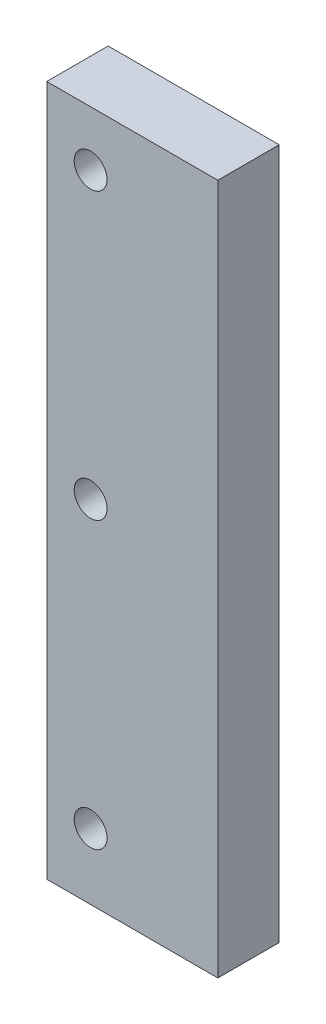
ISO-10303-21;
HEADER;
FILE_DESCRIPTION(('STEP AP214'),'2;1');
FILE_NAME('part.step','',(''),(''),'','','');
FILE_SCHEMA(('AUTOMOTIVE_DESIGN { 1 0 10303 214 1 1 1 1 }'));
ENDSEC;
DATA;
#1=APPLICATION_CONTEXT('core data for automotive mechanical design processes');
#2=APPLICATION_PROTOCOL_DEFINITION('international standard','automotive_design',2000,#1);
#3=PRODUCT_CONTEXT('',#1,'mechanical');
#4=PRODUCT('Part','Part','',(#3));
#5=PRODUCT_RELATED_PRODUCT_CATEGORY('part','',(#4));
#6=PRODUCT_DEFINITION_FORMATION('','',#4);
#7=PRODUCT_DEFINITION_CONTEXT('part definition',#1,'design');
#8=PRODUCT_DEFINITION('design','',#6,#7);
#9=PRODUCT_DEFINITION_SHAPE('','',#8);
#10=(LENGTH_UNIT() NAMED_UNIT(*) SI_UNIT(.MILLI.,.METRE.));
#11=(NAMED_UNIT(*) PLANE_ANGLE_UNIT() SI_UNIT($,.RADIAN.));
#12=(NAMED_UNIT(*) SI_UNIT($,.STERADIAN.) SOLID_ANGLE_UNIT());
#13=UNCERTAINTY_MEASURE_WITH_UNIT(LENGTH_MEASURE(1.E-05),#10,'distance_accuracy_value','');
#14=(GEOMETRIC_REPRESENTATION_CONTEXT(3) GLOBAL_UNCERTAINTY_ASSIGNED_CONTEXT((#13)) GLOBAL_UNIT_ASSIGNED_CONTEXT((#10,
#11,#12)) REPRESENTATION_CONTEXT('',''));
#15=CARTESIAN_POINT('',(0.,0.,0.));
#16=DIRECTION('',(0.,0.,1.));
#17=DIRECTION('',(1.,0.,0.));
#18=AXIS2_PLACEMENT_3D('',#15,#16,#17);
#19=CARTESIAN_POINT('',(-46.5606060606061,253.648268398268,28.));
#20=DIRECTION('',(1.,0.,0.));
#21=DIRECTION('',(0.,1.,0.));
#22=AXIS2_PLACEMENT_3D('',#19,#20,#21);
#23=PLANE('',#22);
#24=DIRECTION('',(0.,-1.,0.));
#25=VECTOR('',#24,1.);
#26=CARTESIAN_POINT('',(-46.5606060606061,253.648268398268,0.));
#27=LINE('',#26,#25);
#28=CARTESIAN_POINT('',(-46.5606060606061,253.648268398268,0.));
#29=VERTEX_POINT('',#28);
#30=CARTESIAN_POINT('',(-46.5606060606061,-61.3517316017316,0.));
#31=VERTEX_POINT('',#30);
#32=EDGE_CURVE('E103',#29,#31,#27,.T.);
#33=ORIENTED_EDGE('',*,*,#32,.T.);
#34=DIRECTION('',(0.,0.,-1.));
#35=VECTOR('',#34,1.);
#36=CARTESIAN_POINT('',(-46.5606060606061,-61.3517316017316,28.));
#37=LINE('',#36,#35);
#38=CARTESIAN_POINT('',(-46.5606060606061,-61.3517316017316,28.));
#39=VERTEX_POINT('',#38);
#40=EDGE_CURVE('E11',#39,#31,#37,.T.);
#41=ORIENTED_EDGE('',*,*,#40,.F.);
#42=DIRECTION('',(0.,-1.,0.));
#43=VECTOR('',#42,1.);
#44=CARTESIAN_POINT('',(-46.5606060606061,253.648268398268,28.));
#45=LINE('',#44,#43);
#46=CARTESIAN_POINT('',(-46.5606060606061,253.648268398268,28.));
#47=VERTEX_POINT('',#46);
#48=EDGE_CURVE('E91',#47,#39,#45,.T.);
#49=ORIENTED_EDGE('',*,*,#48,.F.);
#50=DIRECTION('',(0.,0.,-1.));
#51=VECTOR('',#50,1.);
#52=CARTESIAN_POINT('',(-46.5606060606061,253.648268398268,28.));
#53=LINE('',#52,#51);
#54=EDGE_CURVE('E99',#47,#29,#53,.T.);
#55=ORIENTED_EDGE('',*,*,#54,.T.);
#56=EDGE_LOOP('',(#33,#41,#49,#55));
#57=FACE_BOUND('',#56,.T.);
#58=ADVANCED_FACE('F40',(#57),#23,.F.);
#59=CARTESIAN_POINT('',(-46.5606060606061,-61.3517316017316,28.));
#60=DIRECTION('',(0.,1.,0.));
#61=DIRECTION('',(0.,0.,1.));
#62=AXIS2_PLACEMENT_3D('',#59,#60,#61);
#63=PLANE('',#62);
#64=DIRECTION('',(1.,0.,0.));
#65=VECTOR('',#64,1.);
#66=CARTESIAN_POINT('',(-46.5606060606061,-61.3517316017316,0.));
#67=LINE('',#66,#65);
#68=CARTESIAN_POINT('',(31.4393939393939,-61.3517316017316,0.));
#69=VERTEX_POINT('',#68);
#70=EDGE_CURVE('E95',#31,#69,#67,.T.);
#71=ORIENTED_EDGE('',*,*,#70,.T.);
#72=DIRECTION('',(0.,0.,-1.));
#73=VECTOR('',#72,1.);
#74=CARTESIAN_POINT('',(31.4393939393939,-61.3517316017316,28.));
#75=LINE('',#74,#73);
#76=CARTESIAN_POINT('',(31.4393939393939,-61.3517316017316,28.));
#77=VERTEX_POINT('',#76);
#78=EDGE_CURVE('E48',#77,#69,#75,.T.);
#79=ORIENTED_EDGE('',*,*,#78,.F.);
#80=DIRECTION('',(1.,0.,0.));
#81=VECTOR('',#80,1.);
#82=CARTESIAN_POINT('',(-46.5606060606061,-61.3517316017316,28.));
#83=LINE('',#82,#81);
#84=EDGE_CURVE('E86',#39,#77,#83,.T.);
#85=ORIENTED_EDGE('',*,*,#84,.F.);
#86=ORIENTED_EDGE('',*,*,#40,.T.);
#87=EDGE_LOOP('',(#71,#79,#85,#86));
#88=FACE_BOUND('',#87,.T.);
#89=ADVANCED_FACE('F94',(#88),#63,.F.);
#90=CARTESIAN_POINT('',(31.4393939393939,253.648268398268,28.));
#91=DIRECTION('',(-1.,0.,0.));
#92=DIRECTION('',(0.,-1.,0.));
#93=AXIS2_PLACEMENT_3D('',#90,#91,#92);
#94=PLANE('',#93);
#95=DIRECTION('',(0.,1.,0.));
#96=VECTOR('',#95,1.);
#97=CARTESIAN_POINT('',(31.4393939393939,253.648268398268,0.));
#98=LINE('',#97,#96);
#99=CARTESIAN_POINT('',(31.4393939393939,253.648268398268,0.));
#100=VERTEX_POINT('',#99);
#101=EDGE_CURVE('E73',#69,#100,#98,.T.);
#102=ORIENTED_EDGE('',*,*,#101,.T.);
#103=DIRECTION('',(0.,0.,-1.));
#104=VECTOR('',#103,1.);
#105=CARTESIAN_POINT('',(31.4393939393939,253.648268398268,28.));
#106=LINE('',#105,#104);
#107=CARTESIAN_POINT('',(31.4393939393939,253.648268398268,28.));
#108=VERTEX_POINT('',#107);
#109=EDGE_CURVE('E96',#108,#100,#106,.T.);
#110=ORIENTED_EDGE('',*,*,#109,.F.);
#111=DIRECTION('',(0.,1.,0.));
#112=VECTOR('',#111,1.);
#113=CARTESIAN_POINT('',(31.4393939393939,253.648268398268,28.));
#114=LINE('',#113,#112);
#115=EDGE_CURVE('E89',#77,#108,#114,.T.);
#116=ORIENTED_EDGE('',*,*,#115,.F.);
#117=ORIENTED_EDGE('',*,*,#78,.T.);
#118=EDGE_LOOP('',(#102,#110,#116,#117));
#119=FACE_BOUND('',#118,.T.);
#120=ADVANCED_FACE('F97',(#119),#94,.F.);
#121=CARTESIAN_POINT('',(-46.5606060606061,253.648268398268,28.));
#122=DIRECTION('',(0.,-1.,0.));
#123=DIRECTION('',(0.,0.,-1.));
#124=AXIS2_PLACEMENT_3D('',#121,#122,#123);
#125=PLANE('',#124);
#126=DIRECTION('',(-1.,0.,0.));
#127=VECTOR('',#126,1.);
#128=CARTESIAN_POINT('',(-46.5606060606061,253.648268398268,0.));
#129=LINE('',#128,#127);
#130=EDGE_CURVE('E79',#100,#29,#129,.T.);
#131=ORIENTED_EDGE('',*,*,#130,.T.);
#132=ORIENTED_EDGE('',*,*,#54,.F.);
#133=DIRECTION('',(-1.,0.,0.));
#134=VECTOR('',#133,1.);
#135=CARTESIAN_POINT('',(-46.5606060606061,253.648268398268,28.));
#136=LINE('',#135,#134);
#137=EDGE_CURVE('E56',#108,#47,#136,.T.);
#138=ORIENTED_EDGE('',*,*,#137,.F.);
#139=ORIENTED_EDGE('',*,*,#109,.T.);
#140=EDGE_LOOP('',(#131,#132,#138,#139));
#141=FACE_BOUND('',#140,.T.);
#142=ADVANCED_FACE('F111',(#141),#125,.F.);
#143=CARTESIAN_POINT('',(0.,0.,28.));
#144=DIRECTION('',(0.,0.,1.));
#145=DIRECTION('',(1.,0.,0.));
#146=AXIS2_PLACEMENT_3D('',#143,#144,#145);
#147=PLANE('',#146);
#148=CARTESIAN_POINT('',(-26.5606060606061,228.648268398268,28.));
#149=DIRECTION('',(0.,0.,1.));
#150=DIRECTION('',(1.,0.,0.));
#151=AXIS2_PLACEMENT_3D('',#148,#149,#150);
#152=CIRCLE('',#151,7.5);
#153=CARTESIAN_POINT('',(-19.0606060606061,228.648268398268,28.));
#154=VERTEX_POINT('',#153);
#155=EDGE_CURVE('E127',#154,#154,#152,.T.);
#156=ORIENTED_EDGE('',*,*,#155,.F.);
#157=EDGE_LOOP('',(#156));
#158=FACE_BOUND('',#157,.T.);
#159=CARTESIAN_POINT('',(-26.5606060606061,98.6482683982684,28.));
#160=DIRECTION('',(0.,0.,1.));
#161=DIRECTION('',(1.,0.,0.));
#162=AXIS2_PLACEMENT_3D('',#159,#160,#161);
#163=CIRCLE('',#162,7.5);
#164=CARTESIAN_POINT('',(-19.0606060606061,98.6482683982684,28.));
#165=VERTEX_POINT('',#164);
#166=EDGE_CURVE('E124',#165,#165,#163,.T.);
#167=ORIENTED_EDGE('',*,*,#166,.F.);
#168=EDGE_LOOP('',(#167));
#169=FACE_BOUND('',#168,.T.);
#170=CARTESIAN_POINT('',(-26.5606060606061,-31.3517316017316,28.));
#171=DIRECTION('',(0.,0.,1.));
#172=DIRECTION('',(1.,0.,0.));
#173=AXIS2_PLACEMENT_3D('',#170,#171,#172);
#174=CIRCLE('',#173,7.5);
#175=CARTESIAN_POINT('',(-19.0606060606061,-31.3517316017316,28.));
#176=VERTEX_POINT('',#175);
#177=EDGE_CURVE('E117',#176,#176,#174,.T.);
#178=ORIENTED_EDGE('',*,*,#177,.F.);
#179=EDGE_LOOP('',(#178));
#180=FACE_BOUND('',#179,.T.);
#181=ORIENTED_EDGE('',*,*,#48,.T.);
#182=ORIENTED_EDGE('',*,*,#84,.T.);
#183=ORIENTED_EDGE('',*,*,#115,.T.);
#184=ORIENTED_EDGE('',*,*,#137,.T.);
#185=EDGE_LOOP('',(#181,#182,#183,#184));
#186=FACE_BOUND('',#185,.T.);
#187=ADVANCED_FACE('F87',(#158,#169,#180,#186),#147,.T.);
#188=CARTESIAN_POINT('',(0.,0.,0.));
#189=DIRECTION('',(0.,0.,1.));
#190=DIRECTION('',(1.,0.,0.));
#191=AXIS2_PLACEMENT_3D('',#188,#189,#190);
#192=PLANE('',#191);
#193=CARTESIAN_POINT('',(-26.5606060606061,228.648268398268,0.));
#194=DIRECTION('',(0.,0.,1.));
#195=DIRECTION('',(1.,0.,0.));
#196=AXIS2_PLACEMENT_3D('',#193,#194,#195);
#197=CIRCLE('',#196,7.5);
#198=CARTESIAN_POINT('',(-19.0606060606061,228.648268398268,0.));
#199=VERTEX_POINT('',#198);
#200=EDGE_CURVE('E106',#199,#199,#197,.F.);
#201=ORIENTED_EDGE('',*,*,#200,.F.);
#202=EDGE_LOOP('',(#201));
#203=FACE_BOUND('',#202,.T.);
#204=CARTESIAN_POINT('',(-26.5606060606061,98.6482683982684,0.));
#205=DIRECTION('',(0.,0.,1.));
#206=DIRECTION('',(1.,0.,0.));
#207=AXIS2_PLACEMENT_3D('',#204,#205,#206);
#208=CIRCLE('',#207,7.5);
#209=CARTESIAN_POINT('',(-19.0606060606061,98.6482683982684,0.));
#210=VERTEX_POINT('',#209);
#211=EDGE_CURVE('E120',#210,#210,#208,.F.);
#212=ORIENTED_EDGE('',*,*,#211,.F.);
#213=EDGE_LOOP('',(#212));
#214=FACE_BOUND('',#213,.T.);
#215=CARTESIAN_POINT('',(-26.5606060606061,-31.3517316017316,0.));
#216=DIRECTION('',(0.,0.,1.));
#217=DIRECTION('',(1.,0.,0.));
#218=AXIS2_PLACEMENT_3D('',#215,#216,#217);
#219=CIRCLE('',#218,7.5);
#220=CARTESIAN_POINT('',(-19.0606060606061,-31.3517316017316,0.));
#221=VERTEX_POINT('',#220);
#222=EDGE_CURVE('E121',#221,#221,#219,.F.);
#223=ORIENTED_EDGE('',*,*,#222,.F.);
#224=EDGE_LOOP('',(#223));
#225=FACE_BOUND('',#224,.T.);
#226=ORIENTED_EDGE('',*,*,#32,.F.);
#227=ORIENTED_EDGE('',*,*,#130,.F.);
#228=ORIENTED_EDGE('',*,*,#101,.F.);
#229=ORIENTED_EDGE('',*,*,#70,.F.);
#230=EDGE_LOOP('',(#226,#227,#228,#229));
#231=FACE_BOUND('',#230,.T.);
#232=ADVANCED_FACE('F114',(#203,#214,#225,#231),#192,.F.);
#233=CARTESIAN_POINT('',(-26.5606060606061,-31.3517316017316,-21.2132034355964));
#234=DIRECTION('',(0.,0.,1.));
#235=DIRECTION('',(1.,0.,0.));
#236=AXIS2_PLACEMENT_3D('',#233,#234,#235);
#237=CYLINDRICAL_SURFACE('',#236,7.5);
#238=ORIENTED_EDGE('',*,*,#222,.T.);
#239=EDGE_LOOP('',(#238));
#240=FACE_BOUND('',#239,.T.);
#241=ORIENTED_EDGE('',*,*,#177,.T.);
#242=EDGE_LOOP('',(#241));
#243=FACE_BOUND('',#242,.T.);
#244=ADVANCED_FACE('F144',(#240,#243),#237,.F.);
#245=CARTESIAN_POINT('',(-26.5606060606061,98.6482683982684,-21.2132034355964));
#246=DIRECTION('',(0.,0.,1.));
#247=DIRECTION('',(1.,0.,0.));
#248=AXIS2_PLACEMENT_3D('',#245,#246,#247);
#249=CYLINDRICAL_SURFACE('',#248,7.5);
#250=ORIENTED_EDGE('',*,*,#211,.T.);
#251=EDGE_LOOP('',(#250));
#252=FACE_BOUND('',#251,.T.);
#253=ORIENTED_EDGE('',*,*,#166,.T.);
#254=EDGE_LOOP('',(#253));
#255=FACE_BOUND('',#254,.T.);
#256=ADVANCED_FACE('F146',(#252,#255),#249,.F.);
#257=CARTESIAN_POINT('',(-26.5606060606061,228.648268398268,-21.2132034355964));
#258=DIRECTION('',(0.,0.,1.));
#259=DIRECTION('',(1.,0.,0.));
#260=AXIS2_PLACEMENT_3D('',#257,#258,#259);
#261=CYLINDRICAL_SURFACE('',#260,7.5);
#262=ORIENTED_EDGE('',*,*,#200,.T.);
#263=EDGE_LOOP('',(#262));
#264=FACE_BOUND('',#263,.T.);
#265=ORIENTED_EDGE('',*,*,#155,.T.);
#266=EDGE_LOOP('',(#265));
#267=FACE_BOUND('',#266,.T.);
#268=ADVANCED_FACE('F135',(#264,#267),#261,.F.);
#269=CLOSED_SHELL('',(#58,#89,#120,#142,#187,#232,#244,#256,#268));
#270=MANIFOLD_SOLID_BREP('B2',#269);
#271=ADVANCED_BREP_SHAPE_REPRESENTATION('',(#18,#270),#14);
#272=SHAPE_DEFINITION_REPRESENTATION(#9,#271);
ENDSEC;
END-ISO-10303-21;
